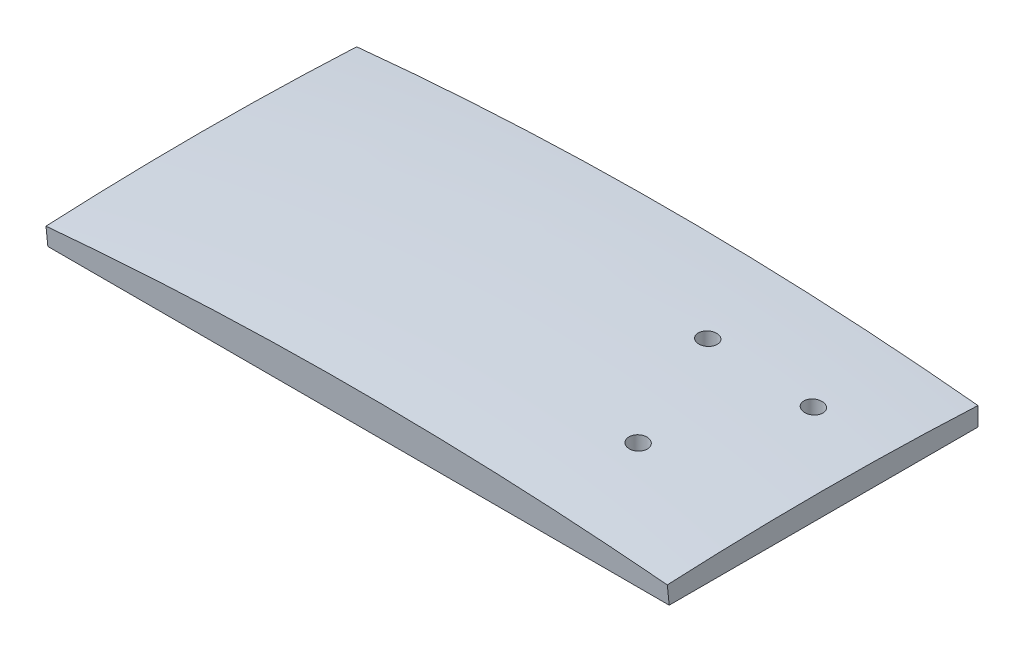
ISO-10303-21;
HEADER;
FILE_DESCRIPTION(('STEP AP214'),'2;1');
FILE_NAME('part.step','',(''),(''),'','','');
FILE_SCHEMA(('AUTOMOTIVE_DESIGN { 1 0 10303 214 1 1 1 1 }'));
ENDSEC;
DATA;
#1=APPLICATION_CONTEXT('core data for automotive mechanical design processes');
#2=APPLICATION_PROTOCOL_DEFINITION('international standard','automotive_design',2000,#1);
#3=PRODUCT_CONTEXT('',#1,'mechanical');
#4=PRODUCT('Part','Part','',(#3));
#5=PRODUCT_RELATED_PRODUCT_CATEGORY('part','',(#4));
#6=PRODUCT_DEFINITION_FORMATION('','',#4);
#7=PRODUCT_DEFINITION_CONTEXT('part definition',#1,'design');
#8=PRODUCT_DEFINITION('design','',#6,#7);
#9=PRODUCT_DEFINITION_SHAPE('','',#8);
#10=(LENGTH_UNIT() NAMED_UNIT(*) SI_UNIT(.MILLI.,.METRE.));
#11=(NAMED_UNIT(*) PLANE_ANGLE_UNIT() SI_UNIT($,.RADIAN.));
#12=(NAMED_UNIT(*) SI_UNIT($,.STERADIAN.) SOLID_ANGLE_UNIT());
#13=UNCERTAINTY_MEASURE_WITH_UNIT(LENGTH_MEASURE(1.E-05),#10,'distance_accuracy_value','');
#14=(GEOMETRIC_REPRESENTATION_CONTEXT(3) GLOBAL_UNCERTAINTY_ASSIGNED_CONTEXT((#13)) GLOBAL_UNIT_ASSIGNED_CONTEXT((#10,
#11,#12)) REPRESENTATION_CONTEXT('',''));
#15=CARTESIAN_POINT('',(0.,0.,0.));
#16=DIRECTION('',(0.,0.,1.));
#17=DIRECTION('',(1.,0.,0.));
#18=AXIS2_PLACEMENT_3D('',#15,#16,#17);
#19=CARTESIAN_POINT('',(50.,-494.49371855331,0.));
#20=DIRECTION('',(0.,0.,1.));
#21=DIRECTION('',(1.,0.,0.));
#22=AXIS2_PLACEMENT_3D('',#19,#20,#21);
#23=PLANE('',#22);
#24=CARTESIAN_POINT('',(50.,-494.49371855331,0.));
#25=DIRECTION('',(0.,0.,1.));
#26=DIRECTION('',(1.,0.,0.));
#27=AXIS2_PLACEMENT_3D('',#24,#25,#26);
#28=CIRCLE('',#27,500.);
#29=CARTESIAN_POINT('',(100.,3.,0.));
#30=VERTEX_POINT('',#29);
#31=CARTESIAN_POINT('',(0.,3.,0.));
#32=VERTEX_POINT('',#31);
#33=EDGE_CURVE('E99',#30,#32,#28,.T.);
#34=ORIENTED_EDGE('',*,*,#33,.F.);
#35=DIRECTION('',(0.,1.,0.));
#36=VECTOR('',#35,1.);
#37=CARTESIAN_POINT('',(100.,0.,0.));
#38=LINE('',#37,#36);
#39=CARTESIAN_POINT('',(100.,0.,0.));
#40=VERTEX_POINT('',#39);
#41=EDGE_CURVE('E94',#40,#30,#38,.T.);
#42=ORIENTED_EDGE('',*,*,#41,.F.);
#43=DIRECTION('',(1.,0.,0.));
#44=VECTOR('',#43,1.);
#45=CARTESIAN_POINT('',(0.,0.,0.));
#46=LINE('',#45,#44);
#47=CARTESIAN_POINT('',(0.,0.,0.));
#48=VERTEX_POINT('',#47);
#49=EDGE_CURVE('E80',#48,#40,#46,.T.);
#50=ORIENTED_EDGE('',*,*,#49,.F.);
#51=DIRECTION('',(0.,-1.,0.));
#52=VECTOR('',#51,1.);
#53=CARTESIAN_POINT('',(0.,0.,0.));
#54=LINE('',#53,#52);
#55=EDGE_CURVE('E88',#32,#48,#54,.T.);
#56=ORIENTED_EDGE('',*,*,#55,.F.);
#57=EDGE_LOOP('',(#34,#42,#50,#56));
#58=FACE_BOUND('',#57,.T.);
#59=ADVANCED_FACE('F39',(#58),#23,.F.);
#60=CARTESIAN_POINT('',(50.,-492.006249960543,0.31285377484435));
#61=DIRECTION('',(0.,-0.099874921777191,0.995));
#62=DIRECTION('',(1.,0.,0.));
#63=AXIS2_PLACEMENT_3D('',#60,#61,#62);
#64=PLANE('',#63);
#65=CARTESIAN_POINT('',(50.,-492.006249960543,0.31285377484435));
#66=DIRECTION('',(0.,-0.099874921777191,0.995));
#67=DIRECTION('',(1.,0.,0.));
#68=AXIS2_PLACEMENT_3D('',#65,#66,#67);
#69=CIRCLE('',#68,500.);
#70=CARTESIAN_POINT('',(100.,3.,50.));
#71=VERTEX_POINT('',#70);
#72=CARTESIAN_POINT('',(0.,3.,50.));
#73=VERTEX_POINT('',#72);
#74=EDGE_CURVE('E62',#71,#73,#69,.T.);
#75=ORIENTED_EDGE('',*,*,#74,.T.);
#76=DIRECTION('',(0.,-0.995,-0.099874921777191));
#77=VECTOR('',#76,1.);
#78=CARTESIAN_POINT('',(0.,0.0149999999999994,49.7003752346685));
#79=LINE('',#78,#77);
#80=CARTESIAN_POINT('',(0.,0.0149999999999933,49.7003752346685));
#81=VERTEX_POINT('',#80);
#82=EDGE_CURVE('E47',#73,#81,#79,.T.);
#83=ORIENTED_EDGE('',*,*,#82,.T.);
#84=DIRECTION('',(1.,0.,0.));
#85=VECTOR('',#84,1.);
#86=CARTESIAN_POINT('',(0.,0.0149999999999994,49.7003752346685));
#87=LINE('',#86,#85);
#88=CARTESIAN_POINT('',(100.,0.0149999999999933,49.7003752346685));
#89=VERTEX_POINT('',#88);
#90=EDGE_CURVE('E11',#81,#89,#87,.T.);
#91=ORIENTED_EDGE('',*,*,#90,.T.);
#92=DIRECTION('',(0.,0.995,0.099874921777191));
#93=VECTOR('',#92,1.);
#94=CARTESIAN_POINT('',(100.,0.0149999999999994,49.7003752346685));
#95=LINE('',#94,#93);
#96=EDGE_CURVE('E87',#89,#71,#95,.T.);
#97=ORIENTED_EDGE('',*,*,#96,.T.);
#98=EDGE_LOOP('',(#75,#83,#91,#97));
#99=FACE_BOUND('',#98,.T.);
#100=ADVANCED_FACE('F120',(#99),#64,.T.);
#101=CARTESIAN_POINT('',(100.,0.,0.));
#102=DIRECTION('',(1.,0.,0.));
#103=DIRECTION('',(0.,0.,-1.));
#104=AXIS2_PLACEMENT_3D('',#101,#102,#103);
#105=PLANE('',#104);
#106=CARTESIAN_POINT('',(100.,-496.374608885954,24.9999999999999));
#107=DIRECTION('',(1.,0.,0.));
#108=DIRECTION('',(0.,0.998749217771909,-0.0499999999999999));
#109=AXIS2_PLACEMENT_3D('',#106,#107,#108);
#110=CIRCLE('',#109,500.);
#111=EDGE_CURVE('E108',#30,#71,#110,.T.);
#112=ORIENTED_EDGE('',*,*,#111,.T.);
#113=ORIENTED_EDGE('',*,*,#96,.F.);
#114=DIRECTION('',(0.,0.000301808572792006,0.999999954455792));
#115=VECTOR('',#114,1.);
#116=CARTESIAN_POINT('',(100.,0.,0.));
#117=LINE('',#116,#115);
#118=EDGE_CURVE('E83',#40,#89,#117,.T.);
#119=ORIENTED_EDGE('',*,*,#118,.F.);
#120=ORIENTED_EDGE('',*,*,#41,.T.);
#121=EDGE_LOOP('',(#112,#113,#119,#120));
#122=FACE_BOUND('',#121,.T.);
#123=ADVANCED_FACE('F93',(#122),#105,.T.);
#124=CARTESIAN_POINT('',(100.,3.,0.));
#125=CARTESIAN_POINT('',(100.,3.83402879226072,16.6597120773928));
#126=CARTESIAN_POINT('',(100.,3.83402879226072,33.3402879226072));
#127=CARTESIAN_POINT('',(100.,3.,50.));
#128=CARTESIAN_POINT('',(66.7225485508993,6.34450971017987,0.));
#129=CARTESIAN_POINT('',(66.7225485508993,7.17853850244059,16.7712887731643));
#130=CARTESIAN_POINT('',(66.7225485508993,7.17295966765202,33.5633017560019));
#131=CARTESIAN_POINT('',(66.7225485508993,6.32778716162897,50.3340326456873));
#132=CARTESIAN_POINT('',(33.2774514491007,6.34450971017987,0.));
#133=CARTESIAN_POINT('',(33.2774514491007,7.17853850244059,16.7712887731643));
#134=CARTESIAN_POINT('',(33.2774514491007,7.17295966765202,33.5633017560019));
#135=CARTESIAN_POINT('',(33.2774514491007,6.32778716162897,50.3340326456873));
#136=CARTESIAN_POINT('',(0.,3.,0.));
#137=CARTESIAN_POINT('',(0.,3.83402879226072,16.6597120773928));
#138=CARTESIAN_POINT('',(0.,3.83402879226072,33.3402879226072));
#139=CARTESIAN_POINT('',(0.,3.,50.));
#140=(BOUNDED_SURFACE() B_SPLINE_SURFACE(3,3,((#124,#125,#126,#127),(#128,#129,#130,#131),(#132,
#133,#134,#135),(#136,#137,#138,#139)),.UNSPECIFIED.,.F.,.F.,
.F.) B_SPLINE_SURFACE_WITH_KNOTS((4,4),(4,4),(0.,1.),(0.,1.),
.UNSPECIFIED.) GEOMETRIC_REPRESENTATION_ITEM() RATIONAL_B_SPLINE_SURFACE(((1.,0.999166145181273,
0.999166145181273,1.),(0.996658291404413,0.995827223085501,0.995827223085501,0.996658291404413),
(0.996658291404413,0.995827223085501,0.995827223085501,0.996658291404413),(1.,0.999166145181273,
0.999166145181273,1.))) REPRESENTATION_ITEM('') SURFACE());
#141=CARTESIAN_POINT('',(80.,5.16184916888464,33.1988211199162));
#142=CARTESIAN_POINT('',(79.915702356822,5.16691044858219,33.1988253503331));
#143=CARTESIAN_POINT('',(79.8313089421084,5.17183947986767,33.2059574601747));
#144=CARTESIAN_POINT('',(79.7065826326096,5.17891729267948,33.2271851525682));
#145=CARTESIAN_POINT('',(79.6652848911496,5.18122569591154,33.2360274983133));
#146=CARTESIAN_POINT('',(79.5835341798461,5.18572486533623,33.257169353126));
#147=CARTESIAN_POINT('',(79.5430819944609,5.18791552501672,33.2694719316891));
#148=CARTESIAN_POINT('',(79.4235901604255,5.19427804886197,33.3114172824252));
#149=CARTESIAN_POINT('',(79.3462582067971,5.19824936547405,33.3461245537433));
#150=CARTESIAN_POINT('',(79.1985142813042,5.20553393367909,33.4280772699807));
#151=CARTESIAN_POINT('',(79.1281023445764,5.20884718193077,33.4753227785594));
#152=CARTESIAN_POINT('',(79.0292576331369,5.21324978336373,33.554495350049));
#153=CARTESIAN_POINT('',(78.9974385548624,5.21462276078134,33.5822699293482));
#154=CARTESIAN_POINT('',(78.9362776378619,5.21717056007356,33.6403750741138));
#155=CARTESIAN_POINT('',(78.9069334502544,5.21834557091668,33.6707031601758));
#156=CARTESIAN_POINT('',(78.8228762065548,5.22156263141248,33.7652720380715));
#157=CARTESIAN_POINT('',(78.7721129792525,5.22329784363078,33.8331179051265));
#158=CARTESIAN_POINT('',(78.682810732889,5.22589115437613,33.9762212205636));
#159=CARTESIAN_POINT('',(78.6442496638036,5.22675084134072,34.051464974146));
#160=CARTESIAN_POINT('',(78.5802860867541,5.22757567086223,34.2073674483725));
#161=CARTESIAN_POINT('',(78.5548834596102,5.22754082152135,34.2880261199647));
#162=CARTESIAN_POINT('',(78.5179870686597,5.22657763252748,34.4523759372524));
#163=CARTESIAN_POINT('',(78.5064802030537,5.22565013600388,34.5360641496853));
#164=CARTESIAN_POINT('',(78.4976501311528,5.22292965257199,34.7041717090892));
#165=CARTESIAN_POINT('',(78.5003268969957,5.22113666736388,34.7885910546238));
#166=CARTESIAN_POINT('',(78.5197828859018,5.21673581832009,34.95579388919));
#167=CARTESIAN_POINT('',(78.536566637547,5.21412769297949,35.0385768441771));
#168=CARTESIAN_POINT('',(78.583754747961,5.20817125976769,35.2001369220805));
#169=CARTESIAN_POINT('',(78.6141592093643,5.20482294631914,35.2789140148069));
#170=CARTESIAN_POINT('',(78.6877694804647,5.19747610600366,35.4303491706415));
#171=CARTESIAN_POINT('',(78.730993715163,5.1934766470464,35.5029982319866));
#172=CARTESIAN_POINT('',(78.8289918197042,5.1849446498937,35.6400014245247));
#173=CARTESIAN_POINT('',(78.8837658047059,5.18041210638324,35.7043554730005));
#174=CARTESIAN_POINT('',(79.0034228204586,5.1709331112621,35.823073980044));
#175=CARTESIAN_POINT('',(79.0683252278177,5.16598587488148,35.877418846394));
#176=CARTESIAN_POINT('',(79.2063183251812,5.15582531979187,35.9744338867956));
#177=CARTESIAN_POINT('',(79.2794090961086,5.15061199845351,36.0171039454545));
#178=CARTESIAN_POINT('',(79.4318300344073,5.14005835533151,36.0896250143936));
#179=CARTESIAN_POINT('',(79.5111699020927,5.1347178454505,36.1194556111638));
#180=CARTESIAN_POINT('',(79.6737376372086,5.12406921215989,36.1653546099473));
#181=CARTESIAN_POINT('',(79.7569655234241,5.11876108890689,36.1814229454608));
#182=CARTESIAN_POINT('',(79.9249950846216,5.10832496951789,36.1993429154072));
#183=CARTESIAN_POINT('',(80.0097975822217,5.10319707182786,36.2011868965128));
#184=CARTESIAN_POINT('',(80.1785233123753,5.09327028867592,36.1905773880796));
#185=CARTESIAN_POINT('',(80.2624465468249,5.08847140250435,36.1781239293805));
#186=CARTESIAN_POINT('',(80.4269628660351,5.07934295496122,36.1392770282395));
#187=CARTESIAN_POINT('',(80.5075583896232,5.07501304596514,36.1128939973588));
#188=CARTESIAN_POINT('',(80.6631873373537,5.06694226896212,36.0469319637202));
#189=CARTESIAN_POINT('',(80.7382208087847,5.0632013959469,36.0073530731691));
#190=CARTESIAN_POINT('',(80.8804578147001,5.05642187639562,35.9161933515093));
#191=CARTESIAN_POINT('',(80.9476744857144,5.05338204301843,35.8646331061558));
#192=CARTESIAN_POINT('',(81.0725033776786,5.04808377943877,35.7509315780948));
#193=CARTESIAN_POINT('',(81.1301156989717,5.04582534107227,35.6887904059471));
#194=CARTESIAN_POINT('',(81.2339850307209,5.04215848958058,35.5558199887509));
#195=CARTESIAN_POINT('',(81.2802635720711,5.04074845718476,35.4850076066432));
#196=CARTESIAN_POINT('',(81.3602853971404,5.03881226630437,35.3366120048196));
#197=CARTESIAN_POINT('',(81.3940288007385,5.03828609936684,35.2590288498643));
#198=CARTESIAN_POINT('',(81.4479826331148,5.03813291869911,35.0994020097991));
#199=CARTESIAN_POINT('',(81.4682103620957,5.03850475269281,35.0173641728117));
#200=CARTESIAN_POINT('',(81.4946305810737,5.0401344237115,34.8510681784268));
#201=CARTESIAN_POINT('',(81.5008230808776,5.04139226011741,34.7668100225807));
#202=CARTESIAN_POINT('',(81.4990015833147,5.04475785644301,34.5984697371715));
#203=CARTESIAN_POINT('',(81.490988849515,5.04686554075514,34.5143875926181));
#204=CARTESIAN_POINT('',(81.4610054360326,5.05186970479791,34.3487857172339));
#205=CARTESIAN_POINT('',(81.4390346632452,5.05476618979003,34.2672660034991));
#206=CARTESIAN_POINT('',(81.3817045368736,5.06127180755348,34.10895461347));
#207=CARTESIAN_POINT('',(81.3463296449049,5.06488176506733,34.0321685451053));
#208=CARTESIAN_POINT('',(81.2840687719862,5.07074534421489,33.9223532664452));
#209=CARTESIAN_POINT('',(81.2617769831948,5.07277506980821,33.8866359103997));
#210=CARTESIAN_POINT('',(81.2142557131618,5.07697285797036,33.8171692560778));
#211=CARTESIAN_POINT('',(81.1890234437002,5.07914105094173,33.7834218720202));
#212=CARTESIAN_POINT('',(81.1091365437735,5.08583340803157,33.6854788339468));
#213=CARTESIAN_POINT('',(81.050314433815,5.09054322239835,33.6246220921186));
#214=CARTESIAN_POINT('',(80.9232999082212,5.10031724085455,33.5136695523289));
#215=CARTESIAN_POINT('',(80.8551075399397,5.10538144315297,33.4635736999892));
#216=CARTESIAN_POINT('',(80.7472177011518,5.11313836455892,33.3975068801539));
#217=CARTESIAN_POINT('',(80.7102471353335,5.11575577491988,33.3769678457617));
#218=CARTESIAN_POINT('',(80.6347454594602,5.12102219648394,33.3390975916598));
#219=CARTESIAN_POINT('',(80.5962157561519,5.12367117774361,33.3217635555403));
#220=CARTESIAN_POINT('',(80.4786898782243,5.13163747038578,33.2747686464037));
#221=CARTESIAN_POINT('',(80.3976374963226,5.13698271503265,33.2500419844541));
#222=CARTESIAN_POINT('',(80.2634092807399,5.14560072478587,33.2211829204061));
#223=CARTESIAN_POINT('',(80.2110923966672,5.14890401159588,33.212810373773));
#224=CARTESIAN_POINT('',(80.1058629377937,5.15543864834549,33.2016281423189));
#225=CARTESIAN_POINT('',(80.0529503624424,5.1586699982186,33.1988184626402));
#226=CARTESIAN_POINT('',(80.,5.16184916888464,33.1988211199162));
#227=B_SPLINE_CURVE_WITH_KNOTS('',3,(#141,#142,#143,#144,#145,#146,#147,#148,#149,#150,#151,
#152,#153,#154,#155,#156,#157,#158,#159,#160,#161,#162,#163,#164,#165,#166,#167,#168,#169,#170,
#171,#172,#173,#174,#175,#176,#177,#178,#179,#180,#181,#182,#183,#184,#185,#186,#187,#188,#189,
#190,#191,#192,#193,#194,#195,#196,#197,#198,#199,#200,#201,#202,#203,#204,#205,#206,#207,#208,
#209,#210,#211,#212,#213,#214,#215,#216,#217,#218,#219,#220,#221,#222,#223,#224,#225,#226),
.UNSPECIFIED.,.T.,.F.,(4,2,2,2,2,2,2,2,2,2,2,2,2,2,2,2,2,2,2,2,2,2,2,2,2,2,2,2,2,2,2,2,2,2,2,2,
2,2,2,2,2,2,4),(0.,0.253121830330347,0.379889827810333,0.50677063496476,0.760059745351626,
1.0133501417631,1.1399927275303,1.26651373347863,1.51945888804632,1.77194431033724,
2.02442744575785,2.27667233783828,2.52891673441176,2.78124213666186,3.03356944026194,
3.28626116902828,3.53895541742234,3.79213915746804,4.04532539986514,4.29891271029377,
4.55250124605914,4.80622621408332,5.05995063482208,5.31348567893816,5.56701856725628,
5.82011902763582,6.0732168435401,6.32583005097741,6.57844084250238,6.83072766700483,
7.08301431522757,7.33527852347098,7.58754441441718,7.84010363729631,7.96643093672939,
8.09287901201952,8.34591086979933,8.59894144889917,8.72592825493783,8.8528029346892,
9.10613674235939,9.26513146348111,9.42412633157905),.UNSPECIFIED.);
#228=CARTESIAN_POINT('',(80.,5.16184916888464,33.1988211199162));
#229=VERTEX_POINT('',#228);
#230=EDGE_CURVE('E163',#229,#229,#227,.T.);
#231=CARTESIAN_POINT('',(71.5,5.53489489313639,13.4983301360425));
#232=CARTESIAN_POINT('',(71.4156374260704,5.53852237966628,13.4983348316856));
#233=CARTESIAN_POINT('',(71.3311924837586,5.54229554678123,13.5054784831186));
#234=CARTESIAN_POINT('',(71.2064148157835,5.54808377736898,13.5267282369446));
#235=CARTESIAN_POINT('',(71.1651037164607,5.55003627493201,13.5355789332224));
#236=CARTESIAN_POINT('',(71.0833349428522,5.55397339918651,13.5567370899702));
#237=CARTESIAN_POINT('',(71.0428780541629,5.55595805271983,13.569047595164));
#238=CARTESIAN_POINT('',(70.923391662302,5.56193117227348,13.6110105202922));
#239=CARTESIAN_POINT('',(70.8460813731586,5.56594645777778,13.6457226441538));
#240=CARTESIAN_POINT('',(70.6983994500809,5.57392789688235,13.7276620397958));
#241=CARTESIAN_POINT('',(70.6280279457111,5.57789404956399,13.774889545209));
#242=CARTESIAN_POINT('',(70.5291966586742,5.58371988404778,13.8540555146265));
#243=CARTESIAN_POINT('',(70.497352850387,5.58564263836439,13.8818552531143));
#244=CARTESIAN_POINT('',(70.4361492085164,5.58943228569036,13.9400120844649));
#245=CARTESIAN_POINT('',(70.4067870177733,5.5912992305953,13.9703666946091));
#246=CARTESIAN_POINT('',(70.3226837545083,5.59680025840839,14.0650174513679));
#247=CARTESIAN_POINT('',(70.2719012609934,5.60033599293871,14.1329203722366));
#248=CARTESIAN_POINT('',(70.182519374453,5.60703339392164,14.2762395630597));
#249=CARTESIAN_POINT('',(70.1439137614761,5.61019525083332,14.3516519711816));
#250=CARTESIAN_POINT('',(70.0799143056206,5.61605943447889,14.5079170133126));
#251=CARTESIAN_POINT('',(70.0545203699395,5.61876176444054,14.5887696091039));
#252=CARTESIAN_POINT('',(70.0177035442991,5.62362667686971,14.7535243839365));
#253=CARTESIAN_POINT('',(70.0062668626666,5.62578979047155,14.837423468053));
#254=CARTESIAN_POINT('',(69.9976482459553,5.62951814854337,15.0059643520134));
#255=CARTESIAN_POINT('',(70.0004661989814,5.63108339770632,15.0906061460219));
#256=CARTESIAN_POINT('',(70.0202724214388,5.63356989478004,15.258134132552));
#257=CARTESIAN_POINT('',(70.0372457549145,5.63449181960776,15.3410220811486));
#258=CARTESIAN_POINT('',(70.0848640928493,5.63566798235178,15.5027781475214));
#259=CARTESIAN_POINT('',(70.1155090507012,5.63592222254423,15.5816462790004));
#260=CARTESIAN_POINT('',(70.1895758602102,5.63575577611767,15.7330703491478));
#261=CARTESIAN_POINT('',(70.2329893249741,5.63533553172352,15.8056303908302));
#262=CARTESIAN_POINT('',(70.3313665148955,5.63383292630655,15.9424371727193));
#263=CARTESIAN_POINT('',(70.3863302243361,5.6327505661847,16.0066839242381));
#264=CARTESIAN_POINT('',(70.5062467043314,5.6299545450806,16.1250455203409));
#265=CARTESIAN_POINT('',(70.5711997836671,5.62824086458135,16.1791600516136));
#266=CARTESIAN_POINT('',(70.7092477849275,5.62423101700998,16.2757251056782));
#267=CARTESIAN_POINT('',(70.7823427320456,5.62193484813544,16.3181755923767));
#268=CARTESIAN_POINT('',(70.9346533901609,5.61682351206827,16.3902416531346));
#269=CARTESIAN_POINT('',(71.0138733655088,5.61400798136219,16.4198481884606));
#270=CARTESIAN_POINT('',(71.1761412864167,5.60793900026283,16.4653515045353));
#271=CARTESIAN_POINT('',(71.2591892531462,5.60468554744758,16.4812482094567));
#272=CARTESIAN_POINT('',(71.4268503495146,5.5978293272679,16.498898526306));
#273=CARTESIAN_POINT('',(71.5114650547222,5.59422619086692,16.5006370285468));
#274=CARTESIAN_POINT('',(71.6797751586461,5.58677574834712,16.4898882768021));
#275=CARTESIAN_POINT('',(71.7634705520203,5.58292844081029,16.4774009401945));
#276=CARTESIAN_POINT('',(71.9276516960533,5.57509488086616,16.4385394039807));
#277=CARTESIAN_POINT('',(72.0081342714249,5.57110849795809,16.412151815004));
#278=CARTESIAN_POINT('',(72.1635219714921,5.56311340143064,16.3462317755257));
#279=CARTESIAN_POINT('',(72.2384270777756,5.5591046877376,16.3066992816332));
#280=CARTESIAN_POINT('',(72.3805663461268,5.5511769099494,16.2155895924986));
#281=CARTESIAN_POINT('',(72.4477971173051,5.54725788609027,16.1640071034214));
#282=CARTESIAN_POINT('',(72.5726383483257,5.53962268512185,16.0502687136993));
#283=CARTESIAN_POINT('',(72.6302488083287,5.53590650800917,15.9881128132311));
#284=CARTESIAN_POINT('',(72.7341938298984,5.52878374191367,15.8550082653545));
#285=CARTESIAN_POINT('',(72.7805315208081,5.52537706717729,15.7840620664233));
#286=CARTESIAN_POINT('',(72.8606283719612,5.51896922677349,15.6353760678582));
#287=CARTESIAN_POINT('',(72.8943875971882,5.51596805901118,15.5576363033242));
#288=CARTESIAN_POINT('',(72.9483359215519,5.51045934605282,15.3976419522795));
#289=CARTESIAN_POINT('',(72.9685368813487,5.50795137077767,15.315391380111));
#290=CARTESIAN_POINT('',(72.9948345815151,5.50349740876445,15.1486511547361));
#291=CARTESIAN_POINT('',(73.0009313811344,5.50155141966558,15.0641615109373));
#292=CARTESIAN_POINT('',(72.9988394175248,5.4982789503157,14.8954367630543));
#293=CARTESIAN_POINT('',(72.9906662245467,5.49695179684345,14.8112014818732));
#294=CARTESIAN_POINT('',(72.9603002685946,5.49495169579115,14.6453002579277));
#295=CARTESIAN_POINT('',(72.9381075503159,5.49427874612545,14.5636343069728));
#296=CARTESIAN_POINT('',(72.8803228413981,5.49360702131567,14.4052131668502));
#297=CARTESIAN_POINT('',(72.8447416444336,5.49360770425394,14.328454079974));
#298=CARTESIAN_POINT('',(72.782158565096,5.49411209295615,14.2186949560632));
#299=CARTESIAN_POINT('',(72.7597573507339,5.4943642093813,14.1829990881202));
#300=CARTESIAN_POINT('',(72.7120130218761,5.49503431750542,14.1135822073566));
#301=CARTESIAN_POINT('',(72.6866671048948,5.4954524681499,14.0798631225231));
#302=CARTESIAN_POINT('',(72.6065447701733,5.49695127668399,13.9821534545681));
#303=CARTESIAN_POINT('',(72.5476186480249,5.49827682148856,13.9214965213723));
#304=CARTESIAN_POINT('',(72.4204305433847,5.50154379894035,13.8109449892767));
#305=CARTESIAN_POINT('',(72.3521686902865,5.50348522305198,13.7610502412375));
#306=CARTESIAN_POINT('',(72.2442513289726,5.5068162970132,13.695313612532));
#307=CARTESIAN_POINT('',(72.2073094793112,5.50799818286985,13.6748995913726));
#308=CARTESIAN_POINT('',(72.1318801770798,5.51049212982895,13.6372704386026));
#309=CARTESIAN_POINT('',(72.0933941174467,5.51180407511717,13.620052499533));
#310=CARTESIAN_POINT('',(71.9760220904874,5.51592162686351,13.5733907777921));
#311=CARTESIAN_POINT('',(71.8951024155631,5.51891265202261,13.5488662342109));
#312=CARTESIAN_POINT('',(71.7614044801972,5.52409351666919,13.5203484319632));
#313=CARTESIAN_POINT('',(71.709473263511,5.5261622689899,13.512103354888));
#314=CARTESIAN_POINT('',(71.6050386787087,5.53043348045644,13.5010927439674));
#315=CARTESIAN_POINT('',(71.5525353104056,5.53263593964596,13.4983272119133));
#316=CARTESIAN_POINT('',(71.5,5.53489489313639,13.4983301360425));
#317=B_SPLINE_CURVE_WITH_KNOTS('',3,(#231,#232,#233,#234,#235,#236,#237,#238,#239,#240,#241,
#242,#243,#244,#245,#246,#247,#248,#249,#250,#251,#252,#253,#254,#255,#256,#257,#258,#259,#260,
#261,#262,#263,#264,#265,#266,#267,#268,#269,#270,#271,#272,#273,#274,#275,#276,#277,#278,#279,
#280,#281,#282,#283,#284,#285,#286,#287,#288,#289,#290,#291,#292,#293,#294,#295,#296,#297,#298,
#299,#300,#301,#302,#303,#304,#305,#306,#307,#308,#309,#310,#311,#312,#313,#314,#315,#316),
.UNSPECIFIED.,.T.,.F.,(4,2,2,2,2,2,2,2,2,2,2,2,2,2,2,2,2,2,2,2,2,2,2,2,2,2,2,2,2,2,2,2,2,2,2,2,
2,2,2,2,2,2,4),(0.,0.253096344697194,0.379855109201613,0.506725775979012,0.759970668638425,
1.01322028911802,1.14003267517588,1.26672322235288,1.52001029800734,1.77316778429319,
2.02632349230387,2.27922884482504,2.53213221211029,2.78476906720947,3.03740506106451,
3.28987548214836,3.54234555968614,3.79482344288463,4.04730210735045,4.29995816270572,
4.55261561546026,4.80554266991263,5.05847119334677,5.31164379601958,5.56481723441327,
5.81810210748351,6.07138697632301,6.32460145234437,6.57781462017667,6.83080598947319,
7.08379629598342,7.33651073260718,7.58922436355962,7.84173469398477,7.9680363846513,
8.09445927728749,8.34691642182923,8.59937006766451,8.72590714821619,8.85233254628993,
9.10476756460812,9.26237881406975,9.4199901150511),.UNSPECIFIED.);
#318=CARTESIAN_POINT('',(71.5,5.53489489313639,13.4983301360425));
#319=VERTEX_POINT('',#318);
#320=EDGE_CURVE('E156',#319,#319,#317,.T.);
#321=CARTESIAN_POINT('',(88.5,4.51391421148998,13.4986382767789));
#322=CARTESIAN_POINT('',(88.4154693247474,4.5204361116359,13.4986420943264));
#323=CARTESIAN_POINT('',(88.3308606553933,4.52710692898107,13.5058131658002));
#324=CARTESIAN_POINT('',(88.2058474050956,4.53717740436515,13.5271442879666));
#325=CARTESIAN_POINT('',(88.1644592654827,4.54054777203415,13.536028900867));
#326=CARTESIAN_POINT('',(88.0825400024946,4.54729157536928,13.5572684751663));
#327=CARTESIAN_POINT('',(88.0420096710285,4.55066501110761,13.5696265047026));
#328=CARTESIAN_POINT('',(87.9223081306874,4.56074027765442,13.6117530265443));
#329=CARTESIAN_POINT('',(87.8448627096665,4.56741025552858,13.6466020582602));
#330=CARTESIAN_POINT('',(87.6969368024068,4.5804635866785,13.7288733539169));
#331=CARTESIAN_POINT('',(87.626456382418,4.58684693722758,13.7762957374378));
#332=CARTESIAN_POINT('',(87.5275094375899,4.59606603406747,13.8557841518617));
#333=CARTESIAN_POINT('',(87.4956427433149,4.59908107257022,13.8836877822158));
#334=CARTESIAN_POINT('',(87.4344026185009,4.60497005798959,13.9420642798352));
#335=CARTESIAN_POINT('',(87.4050268244239,4.60784413754061,13.972534655593));
#336=CARTESIAN_POINT('',(87.320900189573,4.61622966119883,14.0675503451373));
#337=CARTESIAN_POINT('',(87.2701246416847,4.62150676266767,14.1357207063317));
#338=CARTESIAN_POINT('',(87.1809011428012,4.63125821054904,14.2794859882307));
#339=CARTESIAN_POINT('',(87.142425188494,4.63573437013241,14.3550635240061));
#340=CARTESIAN_POINT('',(87.0787197263265,4.64377370782651,14.5116662733089));
#341=CARTESIAN_POINT('',(87.0534899671212,4.64733690325997,14.5926913834361));
#342=CARTESIAN_POINT('',(87.0170847182763,4.65343665572586,14.7576123503294));
#343=CARTESIAN_POINT('',(87.0058662519745,4.6559763358596,14.8414986138073));
#344=CARTESIAN_POINT('',(86.9976739789754,4.65997147563152,15.009989868879));
#345=CARTESIAN_POINT('',(87.0006999234321,4.6614269542099,15.0945948478913));
#346=CARTESIAN_POINT('',(87.0208941305248,4.66320912892351,15.2618944703146));
#347=CARTESIAN_POINT('',(87.038026679344,4.6635386647802,15.3445933963599));
#348=CARTESIAN_POINT('',(87.0859024783997,4.66306738972672,15.5059491869249));
#349=CARTESIAN_POINT('',(87.1166456377623,4.66226658636341,15.5846060784282));
#350=CARTESIAN_POINT('',(87.1908310392424,4.65955898224741,15.7355778444742));
#351=CARTESIAN_POINT('',(87.2342622797801,4.65765313824938,15.8078981430257));
#352=CARTESIAN_POINT('',(87.3325919599391,4.65279111970432,15.9442297144487));
#353=CARTESIAN_POINT('',(87.3874904342486,4.64983494198001,16.0082409621846));
#354=CARTESIAN_POINT('',(87.5072582740844,4.64295302889437,16.1262244442587));
#355=CARTESIAN_POINT('',(87.5721392246328,4.63902616376165,16.1801848512993));
#356=CARTESIAN_POINT('',(87.7099772390951,4.63031694359744,16.2764653705204));
#357=CARTESIAN_POINT('',(87.7829344088773,4.62553457735098,16.318785330085));
#358=CARTESIAN_POINT('',(87.9350620503335,4.61523643144811,16.3907079851078));
#359=CARTESIAN_POINT('',(88.0142486972011,4.60971871481169,16.420276188607));
#360=CARTESIAN_POINT('',(88.1764192689394,4.59811655332415,16.4657144961313));
#361=CARTESIAN_POINT('',(88.2594032577892,4.59203209892263,16.4815843692717));
#362=CARTESIAN_POINT('',(88.4270822013894,4.57944926885329,16.499222243676));
#363=CARTESIAN_POINT('',(88.5117815852488,4.57294969275743,16.5009472912058));
#364=CARTESIAN_POINT('',(88.6802500567321,4.5597373421943,16.49014555432));
#365=CARTESIAN_POINT('',(88.7640191316968,4.55302456483069,16.4776185762099));
#366=CARTESIAN_POINT('',(88.9284305174668,4.53956160874238,16.4386305683416));
#367=CARTESIAN_POINT('',(89.00906603193,4.53281138145799,16.412140888695));
#368=CARTESIAN_POINT('',(89.1647389094429,4.51947882910663,16.3459584848215));
#369=CARTESIAN_POINT('',(89.2397762496239,4.51289650472562,16.3062657066637));
#370=CARTESIAN_POINT('',(89.382130312251,4.50008573925149,16.2147863898362));
#371=CARTESIAN_POINT('',(89.4494456439992,4.49385736200421,16.162997677828));
#372=CARTESIAN_POINT('',(89.5744139438344,4.48193365055377,16.0487907812395));
#373=CARTESIAN_POINT('',(89.6320669770932,4.4762383127554,15.9863726683598));
#374=CARTESIAN_POINT('',(89.7359575726223,4.46555373265912,15.8527931927602));
#375=CARTESIAN_POINT('',(89.7822153305582,4.46056324795942,15.7816476378153));
#376=CARTESIAN_POINT('',(89.8621099913742,4.45142002129837,15.6325421946258));
#377=CARTESIAN_POINT('',(89.895747102564,4.44726726551043,15.5545824188792));
#378=CARTESIAN_POINT('',(89.9493383447131,4.43993068810405,15.3943085426247));
#379=CARTESIAN_POINT('',(89.9693328097336,4.43674402592005,15.3120080593925));
#380=CARTESIAN_POINT('',(89.9952111741623,4.43141529818512,15.1451852654088));
#381=CARTESIAN_POINT('',(90.0010952867634,4.42927321685205,15.0606629882459));
#382=CARTESIAN_POINT('',(89.9985729365973,4.42610056876262,14.892049436237));
#383=CARTESIAN_POINT('',(89.9902070885581,4.42506685664837,14.8079576193348));
#384=CARTESIAN_POINT('',(89.9595026669155,4.42412966274982,14.6423698887638));
#385=CARTESIAN_POINT('',(89.9371642143864,4.42422617117216,14.560873952608));
#386=CARTESIAN_POINT('',(89.8791621372116,4.42554713997666,14.4028675728343));
#387=CARTESIAN_POINT('',(89.8435178409558,4.42676996800239,14.3263500858127));
#388=CARTESIAN_POINT('',(89.7809004494725,4.42941789731958,14.2169564201894));
#389=CARTESIAN_POINT('',(89.7584978139041,4.43043641989936,14.1813828490917));
#390=CARTESIAN_POINT('',(89.7107717594402,4.43273828379967,14.1122099762298));
#391=CARTESIAN_POINT('',(89.6854455784668,4.43402187646858,14.0786125874847));
#392=CARTESIAN_POINT('',(89.605375134325,4.43825617582967,13.9812141664877));
#393=CARTESIAN_POINT('',(89.5465055560609,4.44159181968982,13.9207486447491));
#394=CARTESIAN_POINT('',(89.4195050503609,4.44919214591744,13.8105590882206));
#395=CARTESIAN_POINT('',(89.351374097277,4.45345683085777,13.7608350831785));
#396=CARTESIAN_POINT('',(89.2436405841504,4.46046133634442,13.6952818806163));
#397=CARTESIAN_POINT('',(89.2067225283217,4.46290323385029,13.6749027927046));
#398=CARTESIAN_POINT('',(89.1313516691382,4.4679692197574,13.6373411309464));
#399=CARTESIAN_POINT('',(89.0929002503869,4.47059314530594,13.6201557492095));
#400=CARTESIAN_POINT('',(88.9756468017845,4.478710885085,13.5735840516791));
#401=CARTESIAN_POINT('',(88.8948271049991,4.48445836870419,13.5491102608895));
#402=CARTESIAN_POINT('',(88.7612628663202,4.49419549824056,13.5206350055189));
#403=CARTESIAN_POINT('',(88.7093554509156,4.49803609029653,13.5123980428559));
#404=CARTESIAN_POINT('',(88.6049753869378,4.50587004236525,13.5013984892059));
#405=CARTESIAN_POINT('',(88.5525027375957,4.50986340258584,13.498635905667));
#406=CARTESIAN_POINT('',(88.5,4.51391421148998,13.4986382767789));
#407=B_SPLINE_CURVE_WITH_KNOTS('',3,(#321,#322,#323,#324,#325,#326,#327,#328,#329,#330,#331,
#332,#333,#334,#335,#336,#337,#338,#339,#340,#341,#342,#343,#344,#345,#346,#347,#348,#349,#350,
#351,#352,#353,#354,#355,#356,#357,#358,#359,#360,#361,#362,#363,#364,#365,#366,#367,#368,#369,
#370,#371,#372,#373,#374,#375,#376,#377,#378,#379,#380,#381,#382,#383,#384,#385,#386,#387,#388,
#389,#390,#391,#392,#393,#394,#395,#396,#397,#398,#399,#400,#401,#402,#403,#404,#405,#406),
.UNSPECIFIED.,.T.,.F.,(4,2,2,2,2,2,2,2,2,2,2,2,2,2,2,2,2,2,2,2,2,2,2,2,2,2,2,2,2,2,2,2,2,2,2,2,
2,2,2,2,2,2,4),(0.,0.25412014703781,0.381392429616948,0.508777489547107,0.763054300515752,
1.01733352989815,1.14459232599022,1.27172898643394,1.52590528185298,1.77949868582668,
2.03308727771963,2.28589611485931,2.53870053551441,2.79086688980058,3.04303156047313,
3.29497822991104,3.54692566149624,3.79916772387489,4.0514130931977,4.30433654048893,
4.55726425070768,4.81095974566554,5.06465868855533,5.31888023119468,5.57310281227305,
5.8273711060163,6.08163768466252,6.33545033519328,6.58925879624307,6.84231359074197,
7.09536456182216,7.34769550230202,7.60002425633581,7.85198788890207,7.9780165529273,
8.10416527488565,8.35626383951624,8.60836310230636,8.73494966143945,8.86142439425469,
9.11396251740821,9.27179853617137,9.42963476967872),.UNSPECIFIED.);
#408=CARTESIAN_POINT('',(88.5,4.51391421148998,13.4986382767789));
#409=VERTEX_POINT('',#408);
#410=EDGE_CURVE('E148',#409,#409,#407,.T.);
#411=CARTESIAN_POINT('',(0.,-496.374608885954,24.9999999999999));
#412=DIRECTION('',(1.,0.,0.));
#413=DIRECTION('',(0.,0.998749217771909,-0.0499999999999999));
#414=AXIS2_PLACEMENT_3D('',#411,#412,#413);
#415=CIRCLE('',#414,500.);
#416=EDGE_CURVE('E113',#32,#73,#415,.T.);
#417=ORIENTED_EDGE('',*,*,#230,.F.);
#418=EDGE_LOOP('',(#417));
#419=FACE_BOUND('',#418,.T.);
#420=ORIENTED_EDGE('',*,*,#320,.F.);
#421=EDGE_LOOP('',(#420));
#422=FACE_BOUND('',#421,.T.);
#423=ORIENTED_EDGE('',*,*,#410,.F.);
#424=EDGE_LOOP('',(#423));
#425=FACE_BOUND('',#424,.T.);
#426=ORIENTED_EDGE('',*,*,#416,.T.);
#427=ORIENTED_EDGE('',*,*,#74,.F.);
#428=ORIENTED_EDGE('',*,*,#111,.F.);
#429=ORIENTED_EDGE('',*,*,#33,.T.);
#430=EDGE_LOOP('',(#426,#427,#428,#429));
#431=FACE_BOUND('',#430,.T.);
#432=ADVANCED_FACE('F124',(#419,#422,#425,#431),#140,.T.);
#433=CARTESIAN_POINT('',(0.,0.,0.));
#434=DIRECTION('',(-1.,0.,0.));
#435=DIRECTION('',(0.,0.,1.));
#436=AXIS2_PLACEMENT_3D('',#433,#434,#435);
#437=PLANE('',#436);
#438=ORIENTED_EDGE('',*,*,#416,.F.);
#439=ORIENTED_EDGE('',*,*,#55,.T.);
#440=DIRECTION('',(0.,0.000301808572792006,0.999999954455792));
#441=VECTOR('',#440,1.);
#442=CARTESIAN_POINT('',(0.,0.,0.));
#443=LINE('',#442,#441);
#444=EDGE_CURVE('E54',#48,#81,#443,.T.);
#445=ORIENTED_EDGE('',*,*,#444,.T.);
#446=ORIENTED_EDGE('',*,*,#82,.F.);
#447=EDGE_LOOP('',(#438,#439,#445,#446));
#448=FACE_BOUND('',#447,.T.);
#449=ADVANCED_FACE('F122',(#448),#437,.T.);
#450=CARTESIAN_POINT('',(100.,0.,0.));
#451=DIRECTION('',(0.,-0.999999954455792,0.000301808572792006));
#452=DIRECTION('',(0.,-0.000301808572792006,-0.999999954455792));
#453=AXIS2_PLACEMENT_3D('',#450,#451,#452);
#454=PLANE('',#453);
#455=CARTESIAN_POINT('',(80.,0.0104728714080855,34.7003759178316));
#456=DIRECTION('',(0.,-0.999999954455792,0.000301808572792006));
#457=DIRECTION('',(0.,-0.000301808572792006,-0.999999954455792));
#458=AXIS2_PLACEMENT_3D('',#455,#456,#457);
#459=CIRCLE('',#458,1.5);
#460=CARTESIAN_POINT('',(80.,0.0100201585488975,33.2003759861479));
#461=VERTEX_POINT('',#460);
#462=EDGE_CURVE('E237',#461,#461,#459,.T.);
#463=ORIENTED_EDGE('',*,*,#462,.F.);
#464=EDGE_LOOP('',(#463));
#465=FACE_BOUND('',#464,.T.);
#466=CARTESIAN_POINT('',(71.5,0.00452712859188009,14.9999993168369));
#467=DIRECTION('',(0.,-0.999999954455792,0.000301808572792006));
#468=DIRECTION('',(0.,-0.000301808572792006,-0.999999954455792));
#469=AXIS2_PLACEMENT_3D('',#466,#467,#468);
#470=CIRCLE('',#469,1.5);
#471=CARTESIAN_POINT('',(71.5,0.00407441573269208,13.4999993851532));
#472=VERTEX_POINT('',#471);
#473=EDGE_CURVE('E239',#472,#472,#470,.T.);
#474=ORIENTED_EDGE('',*,*,#473,.F.);
#475=EDGE_LOOP('',(#474));
#476=FACE_BOUND('',#475,.T.);
#477=CARTESIAN_POINT('',(88.5,0.00452712859188009,14.9999993168369));
#478=DIRECTION('',(0.,-0.999999954455792,0.000301808572792006));
#479=DIRECTION('',(0.,-0.000301808572792006,-0.999999954455792));
#480=AXIS2_PLACEMENT_3D('',#477,#478,#479);
#481=CIRCLE('',#480,1.5);
#482=CARTESIAN_POINT('',(88.5,0.00407441573269208,13.4999993851532));
#483=VERTEX_POINT('',#482);
#484=EDGE_CURVE('E245',#483,#483,#481,.T.);
#485=ORIENTED_EDGE('',*,*,#484,.F.);
#486=EDGE_LOOP('',(#485));
#487=FACE_BOUND('',#486,.T.);
#488=ORIENTED_EDGE('',*,*,#444,.F.);
#489=ORIENTED_EDGE('',*,*,#49,.T.);
#490=ORIENTED_EDGE('',*,*,#118,.T.);
#491=ORIENTED_EDGE('',*,*,#90,.F.);
#492=EDGE_LOOP('',(#488,#489,#490,#491));
#493=FACE_BOUND('',#492,.T.);
#494=ADVANCED_FACE('F82',(#465,#476,#487,#493),#454,.T.);
#495=CARTESIAN_POINT('',(88.5,100.004522574171,14.9698184595577));
#496=DIRECTION('',(0.,-0.999999954455792,0.000301808572792006));
#497=DIRECTION('',(0.,-0.000301808572792006,-0.999999954455792));
#498=AXIS2_PLACEMENT_3D('',#495,#496,#497);
#499=CYLINDRICAL_SURFACE('',#498,1.5);
#500=ORIENTED_EDGE('',*,*,#410,.T.);
#501=EDGE_LOOP('',(#500));
#502=FACE_BOUND('',#501,.T.);
#503=ORIENTED_EDGE('',*,*,#484,.T.);
#504=EDGE_LOOP('',(#503));
#505=FACE_BOUND('',#504,.T.);
#506=ADVANCED_FACE('F172',(#502,#505),#499,.F.);
#507=CARTESIAN_POINT('',(71.5,100.004522574171,14.9698184595577));
#508=DIRECTION('',(0.,-0.999999954455792,0.000301808572792006));
#509=DIRECTION('',(0.,-0.000301808572792006,-0.999999954455792));
#510=AXIS2_PLACEMENT_3D('',#507,#508,#509);
#511=CYLINDRICAL_SURFACE('',#510,1.5);
#512=ORIENTED_EDGE('',*,*,#320,.T.);
#513=EDGE_LOOP('',(#512));
#514=FACE_BOUND('',#513,.T.);
#515=ORIENTED_EDGE('',*,*,#473,.T.);
#516=EDGE_LOOP('',(#515));
#517=FACE_BOUND('',#516,.T.);
#518=ADVANCED_FACE('F168',(#514,#517),#511,.F.);
#519=CARTESIAN_POINT('',(80.,100.010468316987,34.6701950605524));
#520=DIRECTION('',(0.,-0.999999954455792,0.000301808572792006));
#521=DIRECTION('',(0.,-0.000301808572792006,-0.999999954455792));
#522=AXIS2_PLACEMENT_3D('',#519,#520,#521);
#523=CYLINDRICAL_SURFACE('',#522,1.5);
#524=ORIENTED_EDGE('',*,*,#230,.T.);
#525=EDGE_LOOP('',(#524));
#526=FACE_BOUND('',#525,.T.);
#527=ORIENTED_EDGE('',*,*,#462,.T.);
#528=EDGE_LOOP('',(#527));
#529=FACE_BOUND('',#528,.T.);
#530=ADVANCED_FACE('F171',(#526,#529),#523,.F.);
#531=CLOSED_SHELL('',(#59,#100,#123,#432,#449,#494,#506,#518,#530));
#532=MANIFOLD_SOLID_BREP('B2',#531);
#533=ADVANCED_BREP_SHAPE_REPRESENTATION('',(#18,#532),#14);
#534=SHAPE_DEFINITION_REPRESENTATION(#9,#533);
ENDSEC;
END-ISO-10303-21;
